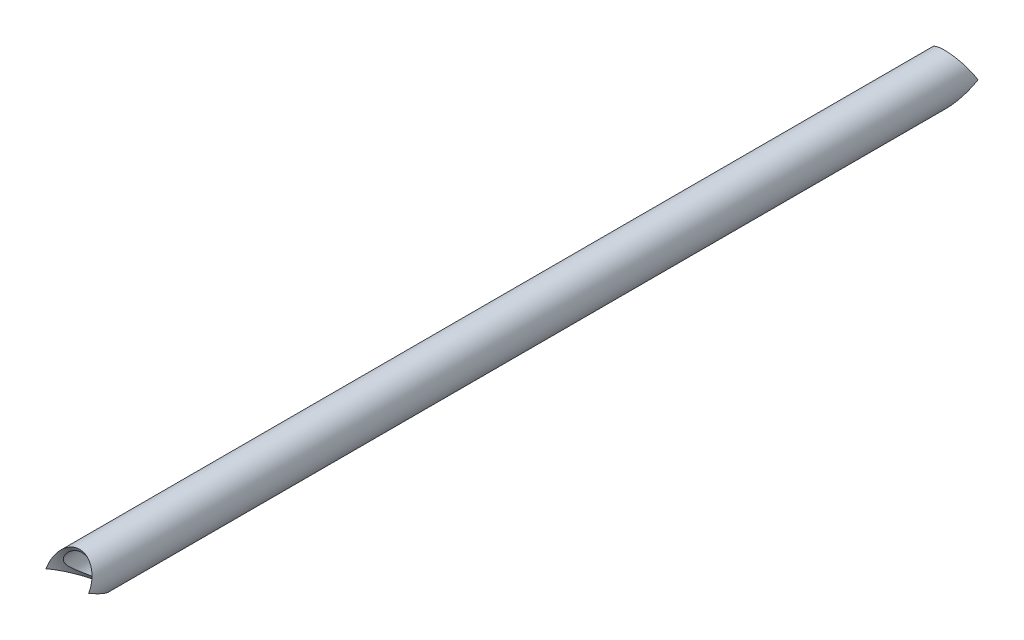
ISO-10303-21;
HEADER;
FILE_DESCRIPTION(('STEP AP214'),'2;1');
FILE_NAME('part.step','',(''),(''),'','','');
FILE_SCHEMA(('AUTOMOTIVE_DESIGN { 1 0 10303 214 1 1 1 1 }'));
ENDSEC;
DATA;
#1=APPLICATION_CONTEXT('core data for automotive mechanical design processes');
#2=APPLICATION_PROTOCOL_DEFINITION('international standard','automotive_design',2000,#1);
#3=PRODUCT_CONTEXT('',#1,'mechanical');
#4=PRODUCT('Part','Part','',(#3));
#5=PRODUCT_RELATED_PRODUCT_CATEGORY('part','',(#4));
#6=PRODUCT_DEFINITION_FORMATION('','',#4);
#7=PRODUCT_DEFINITION_CONTEXT('part definition',#1,'design');
#8=PRODUCT_DEFINITION('design','',#6,#7);
#9=PRODUCT_DEFINITION_SHAPE('','',#8);
#10=(LENGTH_UNIT() NAMED_UNIT(*) SI_UNIT(.MILLI.,.METRE.));
#11=(NAMED_UNIT(*) PLANE_ANGLE_UNIT() SI_UNIT($,.RADIAN.));
#12=(NAMED_UNIT(*) SI_UNIT($,.STERADIAN.) SOLID_ANGLE_UNIT());
#13=UNCERTAINTY_MEASURE_WITH_UNIT(LENGTH_MEASURE(1.E-05),#10,'distance_accuracy_value','');
#14=(GEOMETRIC_REPRESENTATION_CONTEXT(3) GLOBAL_UNCERTAINTY_ASSIGNED_CONTEXT((#13)) GLOBAL_UNIT_ASSIGNED_CONTEXT((#10,
#11,#12)) REPRESENTATION_CONTEXT('',''));
#15=CARTESIAN_POINT('',(0.,0.,0.));
#16=DIRECTION('',(0.,0.,1.));
#17=DIRECTION('',(1.,0.,0.));
#18=AXIS2_PLACEMENT_3D('',#15,#16,#17);
#19=CARTESIAN_POINT('',(4.44089209850063E-13,-5.32499999998193,-234.657183251675));
#20=DIRECTION('',(0.,0.,1.));
#21=DIRECTION('',(1.,0.,0.));
#22=AXIS2_PLACEMENT_3D('',#19,#20,#21);
#23=CYLINDRICAL_SURFACE('',#22,10.65);
#24=CARTESIAN_POINT('',(2.22044604925031E-13,-5.32499999998171,-221.925609816531));
#25=DIRECTION('',(0.,0.866025403784406,0.500000000000062));
#26=DIRECTION('',(0.,-0.500000000000062,0.866025403784405));
#27=AXIS2_PLACEMENT_3D('',#24,#25,#26);
#28=ELLIPSE('',#27,21.2999999999974,10.65);
#29=CARTESIAN_POINT('',(-10.6499999999997,-5.32499999998121,-221.925609816532));
#30=VERTEX_POINT('',#29);
#31=CARTESIAN_POINT('',(10.6500000000003,-5.32499999998209,-221.925609816532));
#32=VERTEX_POINT('',#31);
#33=EDGE_CURVE('E53',#30,#32,#28,.T.);
#34=ORIENTED_EDGE('',*,*,#33,.T.);
#35=CARTESIAN_POINT('',(2.22044604925031E-13,-5.32499999998171,-221.925609816531));
#36=DIRECTION('',(0.,-0.500000000000062,0.866025403784405));
#37=DIRECTION('',(0.,0.866025403784406,0.500000000000062));
#38=AXIS2_PLACEMENT_3D('',#35,#36,#37);
#39=ELLIPSE('',#38,12.2975607337395,10.65);
#40=EDGE_CURVE('E59',#32,#30,#39,.T.);
#41=ORIENTED_EDGE('',*,*,#40,.T.);
#42=EDGE_LOOP('',(#34,#41));
#43=FACE_BOUND('',#42,.T.);
#44=CARTESIAN_POINT('',(4.44089209850063E-13,-5.32499999998193,221.925609816532));
#45=DIRECTION('',(0.,-0.866025403784405,0.500000000000063));
#46=DIRECTION('',(0.,-0.500000000000063,-0.866025403784405));
#47=AXIS2_PLACEMENT_3D('',#44,#45,#46);
#48=ELLIPSE('',#47,21.2999999999974,10.65);
#49=CARTESIAN_POINT('',(-10.6499999999995,-5.32499999998171,221.925609816532));
#50=VERTEX_POINT('',#49);
#51=CARTESIAN_POINT('',(10.6500000000003,-5.32499999998121,221.925609816531));
#52=VERTEX_POINT('',#51);
#53=EDGE_CURVE('E78',#50,#52,#48,.T.);
#54=ORIENTED_EDGE('',*,*,#53,.F.);
#55=CARTESIAN_POINT('',(4.44089209850063E-13,-5.32499999998193,221.925609816532));
#56=DIRECTION('',(0.,0.500000000000063,0.866025403784405));
#57=DIRECTION('',(0.,0.866025403784405,-0.500000000000063));
#58=AXIS2_PLACEMENT_3D('',#55,#56,#57);
#59=ELLIPSE('',#58,12.2975607337395,10.65);
#60=EDGE_CURVE('E74',#52,#50,#59,.T.);
#61=ORIENTED_EDGE('',*,*,#60,.F.);
#62=EDGE_LOOP('',(#54,#61));
#63=FACE_BOUND('',#62,.T.);
#64=ADVANCED_FACE('F48',(#43,#63),#23,.T.);
#65=CARTESIAN_POINT('',(4.44089209850063E-13,-5.32499999998193,-234.657183251675));
#66=DIRECTION('',(0.,0.,1.));
#67=DIRECTION('',(1.,0.,0.));
#68=AXIS2_PLACEMENT_3D('',#65,#66,#67);
#69=CYLINDRICAL_SURFACE('',#68,8.65);
#70=CARTESIAN_POINT('',(8.65000000000038,-5.32499999998209,-214.751582588633));
#71=CARTESIAN_POINT('',(8.64999937803364,-5.17818391802306,-214.836346880916));
#72=CARTESIAN_POINT('',(8.64626274910749,-5.02875572476827,-214.916598939506));
#73=CARTESIAN_POINT('',(8.63051404007051,-4.7251506514308,-215.066664752125));
#74=CARTESIAN_POINT('',(8.61850310980548,-4.57097443400514,-215.136479954882));
#75=CARTESIAN_POINT('',(8.58549136002949,-4.25897766815887,-215.26439202705));
#76=CARTESIAN_POINT('',(8.56450206368796,-4.10116203548692,-215.322503776979));
#77=CARTESIAN_POINT('',(8.51297710355461,-3.7830279028324,-215.426364075996));
#78=CARTESIAN_POINT('',(8.48244146927632,-3.62270941058915,-215.472112663307));
#79=CARTESIAN_POINT('',(8.41148621827954,-3.30100459505963,-215.551150890305));
#80=CARTESIAN_POINT('',(8.37105601253826,-3.13961730919454,-215.584427084998));
#81=CARTESIAN_POINT('',(8.2803069748773,-2.81761051835021,-215.638973092536));
#82=CARTESIAN_POINT('',(8.22998781020925,-2.65699103939285,-215.660242501277));
#83=CARTESIAN_POINT('',(8.11955918288871,-2.33771822961584,-215.691868713442));
#84=CARTESIAN_POINT('',(8.05943008935741,-2.17906954212537,-215.70220331801));
#85=CARTESIAN_POINT('',(7.92980127101999,-1.8652904044047,-215.713292877651));
#86=CARTESIAN_POINT('',(7.86029883349701,-1.71016098791805,-215.714045053458));
#87=CARTESIAN_POINT('',(7.69251740767358,-1.36343015091629,-215.706625782806));
#88=CARTESIAN_POINT('',(7.59151815094368,-1.17319572046207,-215.696008886825));
#89=CARTESIAN_POINT('',(7.37601667855912,-0.801384915040869,-215.664903576278));
#90=CARTESIAN_POINT('',(7.26151062378767,-0.619811022404594,-215.644412349941));
#91=CARTESIAN_POINT('',(7.01974442801474,-0.266185998610567,-215.596289892595));
#92=CARTESIAN_POINT('',(6.89247464409748,-0.094142222051876,-215.568653238005));
#93=CARTESIAN_POINT('',(6.62602035216143,0.239525172020258,-215.508607871281));
#94=CARTESIAN_POINT('',(6.48683667995949,0.401149519114666,-215.47619949379));
#95=CARTESIAN_POINT('',(6.19369921715765,0.717199408950934,-215.407764760104));
#96=CARTESIAN_POINT('',(6.03946719637264,0.871351742228625,-215.371669240231));
#97=CARTESIAN_POINT('',(5.71996280967964,1.16745458200224,-215.298337988732));
#98=CARTESIAN_POINT('',(5.55469039583168,1.30940503550862,-215.261102252154));
#99=CARTESIAN_POINT('',(5.21389860047947,1.58044322936696,-215.187000834829));
#100=CARTESIAN_POINT('',(5.03838164399975,1.70953399435844,-215.150135068905));
#101=CARTESIAN_POINT('',(4.67787691764177,1.95424676282477,-215.078035733551));
#102=CARTESIAN_POINT('',(4.4928889752523,2.06986852083989,-215.042802193872));
#103=CARTESIAN_POINT('',(4.08963935720814,2.30115050106164,-214.97063342319));
#104=CARTESIAN_POINT('',(3.87018262639303,2.41485316135069,-214.934074544973));
#105=CARTESIAN_POINT('',(3.42170434916182,2.62330748091564,-214.865738468753));
#106=CARTESIAN_POINT('',(3.19268197861209,2.71805750322719,-214.833961683845));
#107=CARTESIAN_POINT('',(2.7266723382216,2.88774898226148,-214.776260503504));
#108=CARTESIAN_POINT('',(2.48968464132811,2.96268937499581,-214.750336422435));
#109=CARTESIAN_POINT('',(2.00954587057627,3.09200831167756,-214.705186159586));
#110=CARTESIAN_POINT('',(1.76639521489067,3.14638824674124,-214.685959524666));
#111=CARTESIAN_POINT('',(1.28688815578027,3.23204637632508,-214.655511643786));
#112=CARTESIAN_POINT('',(1.05071773862614,3.2642532418633,-214.643969360813));
#113=CARTESIAN_POINT('',(0.576287751522693,3.30906969932703,-214.627876538471));
#114=CARTESIAN_POINT('',(0.338028232849564,3.32167977090171,-214.623325827978));
#115=CARTESIAN_POINT('',(-0.138694398065383,3.32717181021318,-214.621345993299));
#116=CARTESIAN_POINT('',(-0.377157454409762,3.32005809032264,-214.623915312404));
#117=CARTESIAN_POINT('',(-0.852499060908007,3.2861855581563,-214.636099206838));
#118=CARTESIAN_POINT('',(-1.08937763949917,3.25942709941277,-214.645713655382));
#119=CARTESIAN_POINT('',(-1.55084699909967,3.18792048411955,-214.671219634455));
#120=CARTESIAN_POINT('',(-1.77556361879891,3.14389120638405,-214.686859931653));
#121=CARTESIAN_POINT('',(-2.22033596035086,3.03830373529312,-214.723988694601));
#122=CARTESIAN_POINT('',(-2.44039182888871,2.97674609448114,-214.745476976005));
#123=CARTESIAN_POINT('',(-2.8743918221639,2.83663978906542,-214.793716157688));
#124=CARTESIAN_POINT('',(-3.08833678882507,2.75809347796742,-214.82046632897));
#125=CARTESIAN_POINT('',(-3.50884695015011,2.58462882674504,-214.878485954275));
#126=CARTESIAN_POINT('',(-3.71541192514874,2.48970999978242,-214.909755542679));
#127=CARTESIAN_POINT('',(-4.12561504865893,2.2813255028262,-214.976824530916));
#128=CARTESIAN_POINT('',(-4.32901148650092,2.1674169408693,-215.012725829146));
#129=CARTESIAN_POINT('',(-4.72560996425159,1.92381198975212,-215.087156214718));
#130=CARTESIAN_POINT('',(-4.91881176220154,1.79411522611734,-215.12568536438));
#131=CARTESIAN_POINT('',(-5.29426000335227,1.51952202324975,-215.204019326192));
#132=CARTESIAN_POINT('',(-5.4764901297907,1.37460378462039,-215.2438259096));
#133=CARTESIAN_POINT('',(-5.82873985001095,1.07050122087435,-215.322975853398));
#134=CARTESIAN_POINT('',(-5.99875927649459,0.911316700363202,-215.362319207435));
#135=CARTESIAN_POINT('',(-6.33518765877007,0.569797671450237,-215.440740789634));
#136=CARTESIAN_POINT('',(-6.50081325634385,0.386655559240311,-215.479670874349));
#137=CARTESIAN_POINT('',(-6.81634213928492,0.00614173896794126,-215.551855359202));
#138=CARTESIAN_POINT('',(-6.96624167784258,-0.191233341352566,-215.585108407939));
#139=CARTESIAN_POINT('',(-7.24880778216959,-0.598626237494485,-215.642302626005));
#140=CARTESIAN_POINT('',(-7.38151120832178,-0.808615550168722,-215.666263939901));
#141=CARTESIAN_POINT('',(-7.62872444595253,-1.24005747420102,-215.700706798231));
#142=CARTESIAN_POINT('',(-7.74324661530748,-1.46150216238097,-215.711197533349));
#143=CARTESIAN_POINT('',(-7.91587661528768,-1.83394120080169,-215.713453861831));
#144=CARTESIAN_POINT('',(-7.97965328460083,-1.98229882169036,-215.710510511407));
#145=CARTESIAN_POINT('',(-8.09865941914343,-2.28194667176339,-215.695658752958));
#146=CARTESIAN_POINT('',(-8.15389168150547,-2.43323592290929,-215.683753286328));
#147=CARTESIAN_POINT('',(-8.25543809691486,-2.73735751110983,-215.649851195509));
#148=CARTESIAN_POINT('',(-8.30176915263731,-2.89018633174852,-215.627873971035));
#149=CARTESIAN_POINT('',(-8.38549388456867,-3.19634433803378,-215.572985934826));
#150=CARTESIAN_POINT('',(-8.42288752849234,-3.34967352548583,-215.540075083595));
#151=CARTESIAN_POINT('',(-8.48887463244779,-3.65583736996,-215.462819916894));
#152=CARTESIAN_POINT('',(-8.51744234753722,-3.80866931715387,-215.418442833467));
#153=CARTESIAN_POINT('',(-8.5659054025564,-4.11200299042584,-215.318457093402));
#154=CARTESIAN_POINT('',(-8.58580081854689,-4.26250473692991,-215.262848535275));
#155=CARTESIAN_POINT('',(-8.61742448664809,-4.56019147254079,-215.140996012749));
#156=CARTESIAN_POINT('',(-8.62914387610727,-4.7073726956162,-215.074740602754));
#157=CARTESIAN_POINT('',(-8.64501885033573,-4.99748069425763,-214.93265877979));
#158=CARTESIAN_POINT('',(-8.64917188259965,-5.14040601811059,-214.856829146184));
#159=CARTESIAN_POINT('',(-8.65091176420854,-5.48194986376196,-214.662429780542));
#160=CARTESIAN_POINT('',(-8.64490991978772,-5.67810720219622,-214.539496812123));
#161=CARTESIAN_POINT('',(-8.62080404537284,-6.06052557383465,-214.280185838456));
#162=CARTESIAN_POINT('',(-8.602693492201,-6.246781214402,-214.143800620018));
#163=CARTESIAN_POINT('',(-8.55591593176097,-6.61050738597429,-213.860366255766));
#164=CARTESIAN_POINT('',(-8.52721453919752,-6.7879471411787,-213.713283641709));
#165=CARTESIAN_POINT('',(-8.4604853905728,-7.13436872183675,-213.411410831007));
#166=CARTESIAN_POINT('',(-8.42245385331503,-7.30334708465508,-213.256617529799));
#167=CARTESIAN_POINT('',(-8.33930780952901,-7.62840220802627,-212.946527773285));
#168=CARTESIAN_POINT('',(-8.2944623361029,-7.78471951598944,-212.791409697913));
#169=CARTESIAN_POINT('',(-8.19738755509973,-8.09107106240098,-212.477399875372));
#170=CARTESIAN_POINT('',(-8.14515935111358,-8.24110623558307,-212.318508695166));
#171=CARTESIAN_POINT('',(-8.03358147622565,-8.53574819846544,-211.997939035223));
#172=CARTESIAN_POINT('',(-7.97422521882674,-8.68034980293024,-211.836258097636));
#173=CARTESIAN_POINT('',(-7.84858289044746,-8.96455859803286,-211.511183076421));
#174=CARTESIAN_POINT('',(-7.78229605383272,-9.10416523457559,-211.347788805317));
#175=CARTESIAN_POINT('',(-7.64278789689129,-9.37889196673921,-211.020007469403));
#176=CARTESIAN_POINT('',(-7.56956237191833,-9.51400927411406,-210.855619859871));
#177=CARTESIAN_POINT('',(-7.41613086611516,-9.78000589103082,-210.526645920566));
#178=CARTESIAN_POINT('',(-7.33592422353068,-9.91088479718915,-210.362059573415));
#179=CARTESIAN_POINT('',(-7.16842967186076,-10.1685222937669,-210.033473896968));
#180=CARTESIAN_POINT('',(-7.08114669097922,-10.2952836670529,-209.869474240791));
#181=CARTESIAN_POINT('',(-6.89920629382322,-10.5448944677682,-209.542591380725));
#182=CARTESIAN_POINT('',(-6.80454875726926,-10.6677438313462,-209.379708195091));
#183=CARTESIAN_POINT('',(-6.56519981119204,-10.9615247675218,-208.986076960955));
#184=CARTESIAN_POINT('',(-6.41648661666482,-11.1304340932259,-208.756242483816));
#185=CARTESIAN_POINT('',(-6.10210401419132,-11.4600386200657,-208.302234552344));
#186=CARTESIAN_POINT('',(-5.93643204735847,-11.620732576094,-208.078061958706));
#187=CARTESIAN_POINT('',(-5.58706670598675,-11.9327156751171,-207.638443174767));
#188=CARTESIAN_POINT('',(-5.40341885193527,-12.0840270661882,-207.422976799174));
#189=CARTESIAN_POINT('',(-5.01605964050969,-12.3762758979054,-207.003381560183));
#190=CARTESIAN_POINT('',(-4.81235869354391,-12.5172186556333,-206.799246899199));
#191=CARTESIAN_POINT('',(-4.46395431537792,-12.7358360009942,-206.480491065245));
#192=CARTESIAN_POINT('',(-4.32596965085815,-12.8173265353461,-206.361142903221));
#193=CARTESIAN_POINT('',(-4.04104693269468,-12.9747682172202,-206.129707893451));
#194=CARTESIAN_POINT('',(-3.89410768994034,-13.0507186260944,-206.017622014184));
#195=CARTESIAN_POINT('',(-3.43953622820783,-13.268863431193,-205.694661392544));
#196=CARTESIAN_POINT('',(-3.11767000653592,-13.4016605290659,-205.496631189449));
#197=CARTESIAN_POINT('',(-2.51329904826397,-13.6064868217737,-205.189928205374));
#198=CARTESIAN_POINT('',(-2.23837288737291,-13.6854670464431,-205.071175308328));
#199=CARTESIAN_POINT('',(-1.8114918358854,-13.7844559440138,-204.922023838064));
#200=CARTESIAN_POINT('',(-1.66677696284452,-13.8142061118071,-204.877135149491));
#201=CARTESIAN_POINT('',(-1.37323763265815,-13.8665986633625,-204.798014086312));
#202=CARTESIAN_POINT('',(-1.22441515227415,-13.8892444033695,-204.763776679934));
#203=CARTESIAN_POINT('',(-0.922228530534799,-13.927057552633,-204.706576123052));
#204=CARTESIAN_POINT('',(-0.768835207762714,-13.9421542687129,-204.683719557063));
#205=CARTESIAN_POINT('',(-0.460111209939097,-13.964139965606,-204.650424523781));
#206=CARTESIAN_POINT('',(-0.304780550296666,-13.9710290116588,-204.63998595778));
#207=CARTESIAN_POINT('',(0.00631804623120824,-13.9763962343405,-204.631853771345));
#208=CARTESIAN_POINT('',(0.162085851106788,-13.9748767236263,-204.634156646554));
#209=CARTESIAN_POINT('',(0.472597570432806,-13.9634770717304,-204.651427005188));
#210=CARTESIAN_POINT('',(0.627341552834353,-13.9535974911319,-204.666393639446));
#211=CARTESIAN_POINT('',(0.914629127249049,-13.9275579323643,-204.705814759986));
#212=CARTESIAN_POINT('',(1.0474667501926,-13.9123698976647,-204.728800235866));
#213=CARTESIAN_POINT('',(1.31053948151354,-13.8761774918129,-204.783530232422));
#214=CARTESIAN_POINT('',(1.44077378597053,-13.85517135286,-204.815277415286));
#215=CARTESIAN_POINT('',(1.82650942834331,-13.7839970078715,-204.922738637013));
#216=CARTESIAN_POINT('',(2.07716005820111,-13.7256618014251,-205.010689174864));
#217=CARTESIAN_POINT('',(2.6770104496413,-13.5587067369494,-205.261634615415));
#218=CARTESIAN_POINT('',(3.01657143771874,-13.4393597726666,-205.440438017218));
#219=CARTESIAN_POINT('',(3.49694388024386,-13.2385470085944,-205.739347740664));
#220=CARTESIAN_POINT('',(3.65245291749774,-13.1678539232032,-205.844283741444));
#221=CARTESIAN_POINT('',(3.95415605806253,-13.0201478760333,-206.062763025778));
#222=CARTESIAN_POINT('',(4.10035178316903,-12.9431360199622,-206.176304803162));
#223=CARTESIAN_POINT('',(4.4721706727773,-12.7339136251342,-206.483531450284));
#224=CARTESIAN_POINT('',(4.69046621582147,-12.5972318742943,-206.683035934362));
#225=CARTESIAN_POINT('',(5.10542040242076,-12.312172229419,-207.09577525316));
#226=CARTESIAN_POINT('',(5.30206445824788,-12.1637865639925,-207.309019193369));
#227=CARTESIAN_POINT('',(5.67619689273806,-11.8566202487894,-207.746177363478));
#228=CARTESIAN_POINT('',(5.85361633779519,-11.697805271473,-207.97012609446));
#229=CARTESIAN_POINT('',(6.19021131260058,-11.37138212261,-208.42504099146));
#230=CARTESIAN_POINT('',(6.34939068740961,-11.2037758152018,-208.656005665462));
#231=CARTESIAN_POINT('',(6.61712450602761,-10.8988278054068,-209.070274217495));
#232=CARTESIAN_POINT('',(6.72902472853623,-10.7631322708348,-209.252645771853));
#233=CARTESIAN_POINT('',(6.94326792392806,-10.4867928999534,-209.619279912847));
#234=CARTESIAN_POINT('',(7.04560988610171,-10.3461485425054,-209.803542697184));
#235=CARTESIAN_POINT('',(7.24122557898553,-10.0596872711422,-210.1732006323));
#236=CARTESIAN_POINT('',(7.33449006193127,-9.91386528461171,-210.358596737527));
#237=CARTESIAN_POINT('',(7.51210861764741,-9.61692902936119,-210.729402184686));
#238=CARTESIAN_POINT('',(7.59646314201742,-9.46581502938333,-210.91481152547));
#239=CARTESIAN_POINT('',(7.75620337110454,-9.15824485940129,-211.284195227615));
#240=CARTESIAN_POINT('',(7.83161100983239,-9.00180301723953,-211.46817201994));
#241=CARTESIAN_POINT('',(7.97368173187831,-8.68259257520654,-211.834056311638));
#242=CARTESIAN_POINT('',(8.04034383363482,-8.51982326782084,-212.015963576646));
#243=CARTESIAN_POINT('',(8.1645967093179,-8.18739573464338,-212.37608482762));
#244=CARTESIAN_POINT('',(8.22219981237352,-8.01774727406432,-212.554303541489));
#245=CARTESIAN_POINT('',(8.32794134031542,-7.67039006344075,-212.905561180107));
#246=CARTESIAN_POINT('',(8.37608284212257,-7.49268395696326,-213.078601773215));
#247=CARTESIAN_POINT('',(8.45472823516498,-7.15916947840876,-213.388375195564));
#248=CARTESIAN_POINT('',(8.48684042867057,-7.00481212054061,-213.526257229807));
#249=CARTESIAN_POINT('',(8.54328935211263,-6.6889815087178,-213.795370466494));
#250=CARTESIAN_POINT('',(8.56762596647568,-6.52750814903404,-213.926601570056));
#251=CARTESIAN_POINT('',(8.60751619567178,-6.19721879363611,-214.180090814585));
#252=CARTESIAN_POINT('',(8.62309164938098,-6.0284221952279,-214.302370599911));
#253=CARTESIAN_POINT('',(8.64433263886626,-5.68273682259217,-214.53590810767));
#254=CARTESIAN_POINT('',(8.65000076614801,-5.50585017694258,-214.647168705257));
#255=CARTESIAN_POINT('',(8.65000000000038,-5.32499999998209,-214.751582588633));
#256=B_SPLINE_CURVE_WITH_KNOTS('',3,(#70,#71,#72,#73,#74,#75,#76,#77,#78,#79,#80,#81,#82,#83,
#84,#85,#86,#87,#88,#89,#90,#91,#92,#93,#94,#95,#96,#97,#98,#99,#100,#101,#102,#103,#104,#105,
#106,#107,#108,#109,#110,#111,#112,#113,#114,#115,#116,#117,#118,#119,#120,#121,#122,#123,#124,
#125,#126,#127,#128,#129,#130,#131,#132,#133,#134,#135,#136,#137,#138,#139,#140,#141,#142,#143,
#144,#145,#146,#147,#148,#149,#150,#151,#152,#153,#154,#155,#156,#157,#158,#159,#160,#161,#162,
#163,#164,#165,#166,#167,#168,#169,#170,#171,#172,#173,#174,#175,#176,#177,#178,#179,#180,#181,
#182,#183,#184,#185,#186,#187,#188,#189,#190,#191,#192,#193,#194,#195,#196,#197,#198,#199,#200,
#201,#202,#203,#204,#205,#206,#207,#208,#209,#210,#211,#212,#213,#214,#215,#216,#217,#218,#219,
#220,#221,#222,#223,#224,#225,#226,#227,#228,#229,#230,#231,#232,#233,#234,#235,#236,#237,#238,
#239,#240,#241,#242,#243,#244,#245,#246,#247,#248,#249,#250,#251,#252,#253,#254,#255),
.UNSPECIFIED.,.T.,.F.,(4,2,2,2,2,2,2,2,2,2,2,2,2,2,2,2,2,2,2,2,2,2,2,2,2,2,2,2,2,2,2,2,2,2,2,2,
2,2,2,2,2,2,2,2,2,2,2,2,2,2,2,2,2,2,2,2,2,2,2,2,2,2,2,2,2,2,2,2,2,2,2,2,2,2,2,2,2,2,2,2,2,2,2,2,
2,2,2,2,2,2,2,2,4),(0.,0.50844506770026,1.01681949312013,1.52454340032976,2.03226573787234,
2.54053382673727,3.04881902097637,3.55813412185313,4.06759693996524,4.71359002947235,
5.3597671778666,6.00643624012396,6.65305997254455,7.31551844685052,7.97797979789318,
8.64028496620524,9.30260220250532,10.0512091879147,10.7998808036038,11.548592622777,
12.2972537751962,13.0122575701411,13.7272438644483,14.4420738478241,15.1568909672324,
15.844665330773,16.5324180161258,17.2200754854142,17.9077534057851,18.6145823037825,
19.32142797006,20.0293001149046,20.7371819564198,21.4861817527532,22.2353595985665,
22.9829040159479,23.7299381284995,24.214039266467,24.6979815901772,25.1809956610552,
25.6640114767323,26.1484232132297,26.6328307010889,27.1177624646531,27.6028577893425,
28.2964167818691,28.9903497083937,29.6865557409425,30.3830443900309,31.0569944659841,
31.7308439043497,32.4053208577872,33.079872400874,33.7548353491975,34.4298623484518,
35.1044232089343,35.7789950738535,36.743430573118,37.7080118098804,38.6702106916384,
39.6319126633926,40.230961324626,40.8300897097652,42.0261773485562,42.9515592316284,
43.4142860297677,43.8767938980596,44.3435554209336,44.8103132336656,45.276942677515,
45.7435408340736,46.1500870679637,46.5567569645798,47.3697458590111,48.5683011522662,
49.1693990091057,49.7703919045981,50.7462014804335,51.7226645377543,52.7025204724636,
53.682169469165,54.4420360299665,55.2019828498207,55.9626959419768,56.7233704590098,
57.4821398028638,58.2409942350127,58.9988067717574,59.7563724579498,60.3844095628087,
61.0124560021514,61.6389298975946,62.2652398987969),.UNSPECIFIED.);
#257=CARTESIAN_POINT('',(8.65000000000038,-5.32499999998209,-214.751582588633));
#258=VERTEX_POINT('',#257);
#259=EDGE_CURVE('E13',#258,#258,#256,.T.);
#260=ORIENTED_EDGE('',*,*,#259,.F.);
#261=EDGE_LOOP('',(#260));
#262=FACE_BOUND('',#261,.T.);
#263=CARTESIAN_POINT('',(8.65000000000027,-5.32499999998198,214.751582588632));
#264=CARTESIAN_POINT('',(8.64999937803355,-5.17818391802293,214.836346880916));
#265=CARTESIAN_POINT('',(8.64626274910741,-5.02875572476845,214.916598939506));
#266=CARTESIAN_POINT('',(8.63051404007046,-4.72515065143115,215.066664752126));
#267=CARTESIAN_POINT('',(8.61850310980542,-4.57097443400534,215.136479954883));
#268=CARTESIAN_POINT('',(8.58549136002949,-4.25897766815894,215.264392027051));
#269=CARTESIAN_POINT('',(8.56450206368801,-4.101162035487,215.32250377698));
#270=CARTESIAN_POINT('',(8.51297710355455,-3.78302790283235,215.426364075997));
#271=CARTESIAN_POINT('',(8.48244146927611,-3.62270941058895,215.472112663307));
#272=CARTESIAN_POINT('',(8.41148621827931,-3.30100459505928,215.551150890306));
#273=CARTESIAN_POINT('',(8.37105601253817,-3.13961730919417,215.584427084999));
#274=CARTESIAN_POINT('',(8.2803069748773,-2.81761051834979,215.638973092537));
#275=CARTESIAN_POINT('',(8.22998781020921,-2.65699103939237,215.660242501277));
#276=CARTESIAN_POINT('',(8.11955918288859,-2.33771822961527,215.691868713443));
#277=CARTESIAN_POINT('',(8.05943008935725,-2.17906954212477,215.702203318011));
#278=CARTESIAN_POINT('',(7.92980127101989,-1.86529040440397,215.713292877651));
#279=CARTESIAN_POINT('',(7.86029883349702,-1.71016098791722,215.714045053458));
#280=CARTESIAN_POINT('',(7.69251740767364,-1.36343015091548,215.706625782806));
#281=CARTESIAN_POINT('',(7.59151815094361,-1.17319572046141,215.696008886826));
#282=CARTESIAN_POINT('',(7.37601667855904,-0.801384915040461,215.664903576278));
#283=CARTESIAN_POINT('',(7.26151062378771,-0.619811022404278,215.644412349941));
#284=CARTESIAN_POINT('',(7.01974442801496,-0.266185998610386,215.596289892595));
#285=CARTESIAN_POINT('',(6.89247464409778,-0.0941422220517391,215.568653238006));
#286=CARTESIAN_POINT('',(6.62602035216185,0.239525172020135,215.508607871281));
#287=CARTESIAN_POINT('',(6.48683667995996,0.401149519114327,215.47619949379));
#288=CARTESIAN_POINT('',(6.19369921715821,0.71719940895058,215.407764760103));
#289=CARTESIAN_POINT('',(6.03946719637323,0.871351742228476,215.371669240231));
#290=CARTESIAN_POINT('',(5.71996280968027,1.16745458200226,215.298337988733));
#291=CARTESIAN_POINT('',(5.5546903958323,1.3094050355086,215.261102252155));
#292=CARTESIAN_POINT('',(5.21389860048014,1.58044322936699,215.187000834829));
#293=CARTESIAN_POINT('',(5.03838164400046,1.70953399435856,215.150135068906));
#294=CARTESIAN_POINT('',(4.67787691764242,1.95424676282478,215.078035733551));
#295=CARTESIAN_POINT('',(4.49288897525286,2.06986852083972,215.042802193873));
#296=CARTESIAN_POINT('',(4.08963935720867,2.30115050106149,214.97063342319));
#297=CARTESIAN_POINT('',(3.87018262639364,2.41485316135082,214.934074544973));
#298=CARTESIAN_POINT('',(3.42170434916245,2.62330748091603,214.865738468754));
#299=CARTESIAN_POINT('',(3.19268197861268,2.71805750322757,214.833961683846));
#300=CARTESIAN_POINT('',(2.72667233822211,2.88774898226182,214.776260503505));
#301=CARTESIAN_POINT('',(2.48968464132858,2.96268937499614,214.750336422435));
#302=CARTESIAN_POINT('',(2.00954587057673,3.09200831167813,214.705186159586));
#303=CARTESIAN_POINT('',(1.76639521489114,3.14638824674207,214.685959524666));
#304=CARTESIAN_POINT('',(1.28688815578069,3.23204637632592,214.655511643786));
#305=CARTESIAN_POINT('',(1.05071773862651,3.26425324186392,214.643969360813));
#306=CARTESIAN_POINT('',(0.576287751522979,3.30906969932752,214.627876538472));
#307=CARTESIAN_POINT('',(0.338028232849824,3.32167977090231,214.623325827978));
#308=CARTESIAN_POINT('',(-0.138694398065157,3.32717181021378,214.621345993299));
#309=CARTESIAN_POINT('',(-0.377157454409544,3.32005809032315,214.623915312404));
#310=CARTESIAN_POINT('',(-0.852499060907842,3.28618555815703,214.636099206839));
#311=CARTESIAN_POINT('',(-1.08937763949905,3.25942709941382,214.645713655383));
#312=CARTESIAN_POINT('',(-1.55084699909957,3.18792048412062,214.671219634455));
#313=CARTESIAN_POINT('',(-1.77556361879878,3.14389120638484,214.686859931653));
#314=CARTESIAN_POINT('',(-2.22033596035068,3.03830373529366,214.723988694601));
#315=CARTESIAN_POINT('',(-2.44039182888852,2.97674609448169,214.745476976005));
#316=CARTESIAN_POINT('',(-2.87439182216383,2.83663978906622,214.793716157688));
#317=CARTESIAN_POINT('',(-3.08833678882513,2.75809347796844,214.82046632897));
#318=CARTESIAN_POINT('',(-3.50884695014996,2.58462882674534,214.878485954275));
#319=CARTESIAN_POINT('',(-3.71541192514823,2.4897099997818,214.909755542679));
#320=CARTESIAN_POINT('',(-4.12561504865851,2.2813255028255,214.976824530916));
#321=CARTESIAN_POINT('',(-4.32901148650097,2.16741694086952,215.012725829146));
#322=CARTESIAN_POINT('',(-4.72560996425195,1.923811989753,215.087156214718));
#323=CARTESIAN_POINT('',(-4.91881176220172,1.79411522611796,215.12568536438));
#324=CARTESIAN_POINT('',(-5.29426000335236,1.51952202325029,215.204019326191));
#325=CARTESIAN_POINT('',(-5.47649012979087,1.37460378462111,215.243825909599));
#326=CARTESIAN_POINT('',(-5.82873985001081,1.07050122087499,215.322975853398));
#327=CARTESIAN_POINT('',(-5.99875927649406,0.911316700363584,215.362319207435));
#328=CARTESIAN_POINT('',(-6.3351876587696,0.569797671450523,215.440740789635));
#329=CARTESIAN_POINT('',(-6.50081325634387,0.386655559240783,215.479670874349));
#330=CARTESIAN_POINT('',(-6.81634213928534,0.00614173896840858,215.551855359202));
#331=CARTESIAN_POINT('',(-6.96624167784291,-0.191233341352287,215.585108407938));
#332=CARTESIAN_POINT('',(-7.24880778217008,-0.598626237494434,215.642302626004));
#333=CARTESIAN_POINT('',(-7.38151120832252,-0.808615550168711,215.6662639399));
#334=CARTESIAN_POINT('',(-7.62872444595294,-1.24005747420145,215.700706798231));
#335=CARTESIAN_POINT('',(-7.74324661530731,-1.4615021623818,215.711197533351));
#336=CARTESIAN_POINT('',(-7.9158766152877,-1.83394120080243,215.713453861832));
#337=CARTESIAN_POINT('',(-7.97965328460119,-1.9822988216908,215.710510511407));
#338=CARTESIAN_POINT('',(-8.09865941914398,-2.28194667176349,215.695658752957));
#339=CARTESIAN_POINT('',(-8.15389168150586,-2.43323592290934,215.683753286327));
#340=CARTESIAN_POINT('',(-8.25543809691505,-2.73735751110968,215.649851195509));
#341=CARTESIAN_POINT('',(-8.30176915263745,-2.89018633174821,215.627873971034));
#342=CARTESIAN_POINT('',(-8.38549388456885,-3.19634433803328,215.572985934826));
#343=CARTESIAN_POINT('',(-8.42288752849259,-3.34967352548531,215.540075083596));
#344=CARTESIAN_POINT('',(-8.48887463244801,-3.65583736995933,215.462819916894));
#345=CARTESIAN_POINT('',(-8.51744234753733,-3.80866931715304,215.418442833467));
#346=CARTESIAN_POINT('',(-8.56590540255643,-4.11200299042496,215.318457093401));
#347=CARTESIAN_POINT('',(-8.58580081854696,-4.26250473692911,215.262848535275));
#348=CARTESIAN_POINT('',(-8.6174244866482,-4.56019147254005,215.140996012748));
#349=CARTESIAN_POINT('',(-8.62914387610737,-4.70737269561545,215.074740602754));
#350=CARTESIAN_POINT('',(-8.64501885033584,-4.99748069425707,214.93265877979));
#351=CARTESIAN_POINT('',(-8.64917188259976,-5.14040601811025,214.856829146184));
#352=CARTESIAN_POINT('',(-8.65091176420865,-5.48194986376156,214.662429780542));
#353=CARTESIAN_POINT('',(-8.64490991978784,-5.67810720219539,214.539496812123));
#354=CARTESIAN_POINT('',(-8.62080404537299,-6.06052557383341,214.280185838456));
#355=CARTESIAN_POINT('',(-8.60269349220116,-6.24678121440079,214.143800620018));
#356=CARTESIAN_POINT('',(-8.55591593176123,-6.61050738597271,213.860366255766));
#357=CARTESIAN_POINT('',(-8.52721453919788,-6.78794714117673,213.713283641709));
#358=CARTESIAN_POINT('',(-8.4604853905731,-7.13436872183525,213.411410831008));
#359=CARTESIAN_POINT('',(-8.42245385331519,-7.30334708465446,213.256617529801));
#360=CARTESIAN_POINT('',(-8.33930780952926,-7.6284022080255,212.946527773287));
#361=CARTESIAN_POINT('',(-8.29446233610338,-7.78471951598771,212.791409697914));
#362=CARTESIAN_POINT('',(-8.19738755510039,-8.0910710623986,212.477399875373));
#363=CARTESIAN_POINT('',(-8.14515935111419,-8.24110623558103,212.318508695167));
#364=CARTESIAN_POINT('',(-8.03358147622624,-8.5357481984637,211.997939035224));
#365=CARTESIAN_POINT('',(-7.97422521882734,-8.68034980292848,211.836258097636));
#366=CARTESIAN_POINT('',(-7.84858289044807,-8.96455859803117,211.511183076422));
#367=CARTESIAN_POINT('',(-7.78229605383332,-9.10416523457399,211.347788805318));
#368=CARTESIAN_POINT('',(-7.64278789689187,-9.37889196673774,211.020007469403));
#369=CARTESIAN_POINT('',(-7.5695623719189,-9.51400927411265,210.855619859872));
#370=CARTESIAN_POINT('',(-7.41613086611568,-9.78000589102956,210.526645920567));
#371=CARTESIAN_POINT('',(-7.33592422353115,-9.91088479718799,210.362059573416));
#372=CARTESIAN_POINT('',(-7.16842967186123,-10.1685222937658,210.033473896968));
#373=CARTESIAN_POINT('',(-7.08114669097974,-10.2952836670518,209.869474240792));
#374=CARTESIAN_POINT('',(-6.89920629382349,-10.5448944677674,209.542591380725));
#375=CARTESIAN_POINT('',(-6.80454875726924,-10.6677438313458,209.379708195092));
#376=CARTESIAN_POINT('',(-6.56519981119182,-10.9615247675218,208.986076960956));
#377=CARTESIAN_POINT('',(-6.41648661666493,-11.1304340932253,208.756242483817));
#378=CARTESIAN_POINT('',(-6.10210401419163,-11.4600386200649,208.302234552344));
#379=CARTESIAN_POINT('',(-5.93643204735863,-11.6207325760934,208.078061958705));
#380=CARTESIAN_POINT('',(-5.58706670598679,-11.9327156751166,207.638443174767));
#381=CARTESIAN_POINT('',(-5.40341885193533,-12.0840270661875,207.422976799174));
#382=CARTESIAN_POINT('',(-5.01605964050959,-12.3762758979051,207.003381560183));
#383=CARTESIAN_POINT('',(-4.81235869354361,-12.5172186556335,206.799246899199));
#384=CARTESIAN_POINT('',(-4.46395431537761,-12.7358360009943,206.480491065245));
#385=CARTESIAN_POINT('',(-4.32596965085792,-12.8173265353458,206.361142903221));
#386=CARTESIAN_POINT('',(-4.04104693269454,-12.9747682172196,206.129707893451));
#387=CARTESIAN_POINT('',(-3.8941076899402,-13.0507186260938,206.017622014184));
#388=CARTESIAN_POINT('',(-3.43953622820762,-13.2688634311929,205.694661392544));
#389=CARTESIAN_POINT('',(-3.11767000653558,-13.4016605290669,205.49663118945));
#390=CARTESIAN_POINT('',(-2.51329904826359,-13.6064868217746,205.189928205375));
#391=CARTESIAN_POINT('',(-2.23837288737257,-13.6854670464433,205.071175308329));
#392=CARTESIAN_POINT('',(-1.81149183588503,-13.7844559440129,204.922023838064));
#393=CARTESIAN_POINT('',(-1.66677696284414,-13.814206111806,204.877135149491));
#394=CARTESIAN_POINT('',(-1.37323763265774,-13.8665986633626,204.798014086312));
#395=CARTESIAN_POINT('',(-1.22441515227372,-13.8892444033711,204.763776679936));
#396=CARTESIAN_POINT('',(-0.922228530534361,-13.9270575526345,204.706576123053));
#397=CARTESIAN_POINT('',(-0.768835207762285,-13.9421542687129,204.683719557064));
#398=CARTESIAN_POINT('',(-0.46011120993869,-13.9641399656048,204.65042452378));
#399=CARTESIAN_POINT('',(-0.304780550296272,-13.9710290116581,204.63998595778));
#400=CARTESIAN_POINT('',(0.00631804623160874,-13.9763962343401,204.631853771345));
#401=CARTESIAN_POINT('',(0.162085851107208,-13.9748767236259,204.634156646554));
#402=CARTESIAN_POINT('',(0.472597570433241,-13.9634770717296,204.651427005188));
#403=CARTESIAN_POINT('',(0.627341552834785,-13.9535974911308,204.666393639446));
#404=CARTESIAN_POINT('',(0.914629127249451,-13.9275579323632,204.705814759986));
#405=CARTESIAN_POINT('',(1.04746675019297,-13.9123698976639,204.728800235866));
#406=CARTESIAN_POINT('',(1.31053948151381,-13.8761774918124,204.783530232422));
#407=CARTESIAN_POINT('',(1.44077378597073,-13.8551713528594,204.815277415286));
#408=CARTESIAN_POINT('',(1.82650942834346,-13.7839970078709,204.922738637013));
#409=CARTESIAN_POINT('',(2.0771600582015,-13.725661801425,205.010689174864));
#410=CARTESIAN_POINT('',(2.6770104496417,-13.5587067369497,205.261634615414));
#411=CARTESIAN_POINT('',(3.01657143771855,-13.4393597726663,205.440438017218));
#412=CARTESIAN_POINT('',(3.49694388024339,-13.2385470085938,205.739347740664));
#413=CARTESIAN_POINT('',(3.65245291749729,-13.1678539232026,205.844283741444));
#414=CARTESIAN_POINT('',(3.9541560580623,-13.020147876033,206.062763025778));
#415=CARTESIAN_POINT('',(4.10035178316899,-12.9431360199621,206.176304803162));
#416=CARTESIAN_POINT('',(4.47217067277732,-12.7339136251343,206.483531450284));
#417=CARTESIAN_POINT('',(4.69046621582115,-12.597231874294,206.683035934362));
#418=CARTESIAN_POINT('',(5.10542040242024,-12.3121722294185,207.09577525316));
#419=CARTESIAN_POINT('',(5.30206445824749,-12.1637865639922,207.309019193369));
#420=CARTESIAN_POINT('',(5.67619689273763,-11.8566202487891,207.746177363478));
#421=CARTESIAN_POINT('',(5.85361633779456,-11.6978052714726,207.97012609446));
#422=CARTESIAN_POINT('',(6.19021131260028,-11.3713821226098,208.42504099146));
#423=CARTESIAN_POINT('',(6.34939068740984,-11.2037758152018,208.656005665462));
#424=CARTESIAN_POINT('',(6.61712450602765,-10.8988278054068,209.070274217495));
#425=CARTESIAN_POINT('',(6.72902472853581,-10.7631322708348,209.252645771853));
#426=CARTESIAN_POINT('',(6.94326792392731,-10.4867928999534,209.619279912847));
#427=CARTESIAN_POINT('',(7.04560988610109,-10.3461485425055,209.803542697184));
#428=CARTESIAN_POINT('',(7.24122557898501,-10.0596872711423,210.1732006323));
#429=CARTESIAN_POINT('',(7.33449006193073,-9.91386528461181,210.358596737527));
#430=CARTESIAN_POINT('',(7.51210861764688,-9.61692902936131,210.729402184686));
#431=CARTESIAN_POINT('',(7.5964631420169,-9.46581502938347,210.91481152547));
#432=CARTESIAN_POINT('',(7.75620337110406,-9.15824485940146,211.284195227614));
#433=CARTESIAN_POINT('',(7.83161100983191,-9.00180301723971,211.46817201994));
#434=CARTESIAN_POINT('',(7.97368173187786,-8.68259257520676,211.834056311638));
#435=CARTESIAN_POINT('',(8.04034383363438,-8.5198232678211,212.015963576646));
#436=CARTESIAN_POINT('',(8.16459670931748,-8.18739573464365,212.37608482762));
#437=CARTESIAN_POINT('',(8.22219981237311,-8.01774727406458,212.554303541489));
#438=CARTESIAN_POINT('',(8.32794134031505,-7.67039006344114,212.905561180107));
#439=CARTESIAN_POINT('',(8.37608284212223,-7.49268395696379,213.078601773215));
#440=CARTESIAN_POINT('',(8.45472823516466,-7.15916947840933,213.388375195564));
#441=CARTESIAN_POINT('',(8.48684042867026,-7.0048121205411,213.526257229807));
#442=CARTESIAN_POINT('',(8.54328935211235,-6.68898150871823,213.795370466494));
#443=CARTESIAN_POINT('',(8.56762596647541,-6.52750814903449,213.926601570056));
#444=CARTESIAN_POINT('',(8.60751619567155,-6.19721879363672,214.180090814585));
#445=CARTESIAN_POINT('',(8.62309164938077,-6.02842219522865,214.302370599912));
#446=CARTESIAN_POINT('',(8.64433263886611,-5.68273682259255,214.53590810767));
#447=CARTESIAN_POINT('',(8.65000076614788,-5.50585017694245,214.647168705256));
#448=CARTESIAN_POINT('',(8.65000000000027,-5.32499999998198,214.751582588632));
#449=B_SPLINE_CURVE_WITH_KNOTS('',3,(#263,#264,#265,#266,#267,#268,#269,#270,#271,#272,#273,
#274,#275,#276,#277,#278,#279,#280,#281,#282,#283,#284,#285,#286,#287,#288,#289,#290,#291,#292,
#293,#294,#295,#296,#297,#298,#299,#300,#301,#302,#303,#304,#305,#306,#307,#308,#309,#310,#311,
#312,#313,#314,#315,#316,#317,#318,#319,#320,#321,#322,#323,#324,#325,#326,#327,#328,#329,#330,
#331,#332,#333,#334,#335,#336,#337,#338,#339,#340,#341,#342,#343,#344,#345,#346,#347,#348,#349,
#350,#351,#352,#353,#354,#355,#356,#357,#358,#359,#360,#361,#362,#363,#364,#365,#366,#367,#368,
#369,#370,#371,#372,#373,#374,#375,#376,#377,#378,#379,#380,#381,#382,#383,#384,#385,#386,#387,
#388,#389,#390,#391,#392,#393,#394,#395,#396,#397,#398,#399,#400,#401,#402,#403,#404,#405,#406,
#407,#408,#409,#410,#411,#412,#413,#414,#415,#416,#417,#418,#419,#420,#421,#422,#423,#424,#425,
#426,#427,#428,#429,#430,#431,#432,#433,#434,#435,#436,#437,#438,#439,#440,#441,#442,#443,#444,
#445,#446,#447,#448),.UNSPECIFIED.,.T.,.F.,(4,2,2,2,2,2,2,2,2,2,2,2,2,2,2,2,2,2,2,2,2,2,2,2,2,2,
2,2,2,2,2,2,2,2,2,2,2,2,2,2,2,2,2,2,2,2,2,2,2,2,2,2,2,2,2,2,2,2,2,2,2,2,2,2,2,2,2,2,2,2,2,2,2,2,
2,2,2,2,2,2,2,2,2,2,2,2,2,2,2,2,2,2,4),(0.,0.508445067700516,1.01681949312054,1.52454340033028,
2.03226573787307,2.5405338267382,3.04881902097741,3.55813412185432,4.06759693996658,
4.71359002947339,5.35976717786729,6.00643624012431,6.65305997254461,7.31551844685065,
7.97797979789331,8.64028496620539,9.30260220250551,10.051209187915,10.7998808036042,
11.5485926227775,12.2972537751968,13.0122575701418,13.7272438644491,14.4420738478249,
15.1568909672333,15.8446653307739,16.5324180161267,17.2200754854151,17.9077534057862,
18.6145823037837,19.3214279700611,20.0293001149055,20.7371819564206,21.4861817527543,
22.235359598568,22.9829040159498,23.7299381285018,24.214039266469,24.6979815901788,
25.1809956610565,25.6640114767331,26.1484232132305,26.6328307010898,27.1177624646542,
27.6028577893437,28.2964167818697,28.9903497083938,29.6865557409421,30.3830443900298,
31.0569944659831,31.7308439043488,32.4053208577865,33.0798724008736,33.7548353491973,
34.4298623484519,35.1044232089346,35.778995073854,36.7434305731188,37.7080118098813,
38.6702106916395,39.6319126633939,40.2309613246273,40.8300897097664,42.0261773485574,
42.9515592316297,43.414286029769,43.8767938980609,44.3435554209348,44.8103132336668,
45.2769426775163,45.7435408340749,46.1500870679649,46.5567569645808,47.3697458590118,
48.5683011522668,49.1693990091064,49.7703919045988,50.746201480434,51.7226645377549,
52.7025204724641,53.6821694691652,54.4420360299666,55.2019828498208,55.9626959419768,
56.7233704590099,57.4821398028638,58.2409942350128,58.9988067717574,59.7563724579498,
60.3844095628087,61.0124560021514,61.6389298975946,62.265239898797),.UNSPECIFIED.);
#450=CARTESIAN_POINT('',(8.65000000000027,-5.32499999998198,214.751582588632));
#451=VERTEX_POINT('',#450);
#452=EDGE_CURVE('E80',#451,#451,#449,.T.);
#453=ORIENTED_EDGE('',*,*,#452,.T.);
#454=EDGE_LOOP('',(#453));
#455=FACE_BOUND('',#454,.T.);
#456=ADVANCED_FACE('F87',(#262,#455),#69,.F.);
#457=CARTESIAN_POINT('',(-2.22044604925031E-13,0.749999999174189,-225.43301270137));
#458=DIRECTION('',(0.,-0.866025403784511,0.499999999999878));
#459=DIRECTION('',(-1.27906742393144E-10,-0.499999999999878,-0.866025403784511));
#460=AXIS2_PLACEMENT_3D('',#457,#458,#459);
#461=CYLINDRICAL_SURFACE('',#460,10.65);
#462=ORIENTED_EDGE('',*,*,#40,.F.);
#463=ORIENTED_EDGE('',*,*,#33,.F.);
#464=EDGE_LOOP('',(#462,#463));
#465=FACE_BOUND('',#464,.T.);
#466=ORIENTED_EDGE('',*,*,#259,.T.);
#467=EDGE_LOOP('',(#466));
#468=FACE_BOUND('',#467,.T.);
#469=ADVANCED_FACE('F50',(#465,#468),#461,.F.);
#470=CARTESIAN_POINT('',(-7.7715611723761E-13,0.74999999917541,225.43301270137));
#471=DIRECTION('',(0.,-0.866025403784511,-0.499999999999879));
#472=DIRECTION('',(-1.27906822792558E-10,-0.499999999999878,0.866025403784512));
#473=AXIS2_PLACEMENT_3D('',#470,#471,#472);
#474=CYLINDRICAL_SURFACE('',#473,10.65);
#475=ORIENTED_EDGE('',*,*,#60,.T.);
#476=ORIENTED_EDGE('',*,*,#53,.T.);
#477=EDGE_LOOP('',(#475,#476));
#478=FACE_BOUND('',#477,.T.);
#479=ORIENTED_EDGE('',*,*,#452,.F.);
#480=EDGE_LOOP('',(#479));
#481=FACE_BOUND('',#480,.T.);
#482=ADVANCED_FACE('F76',(#478,#481),#474,.F.);
#483=CLOSED_SHELL('',(#64,#456,#469,#482));
#484=MANIFOLD_SOLID_BREP('B2',#483);
#485=ADVANCED_BREP_SHAPE_REPRESENTATION('',(#18,#484),#14);
#486=SHAPE_DEFINITION_REPRESENTATION(#9,#485);
ENDSEC;
END-ISO-10303-21;
